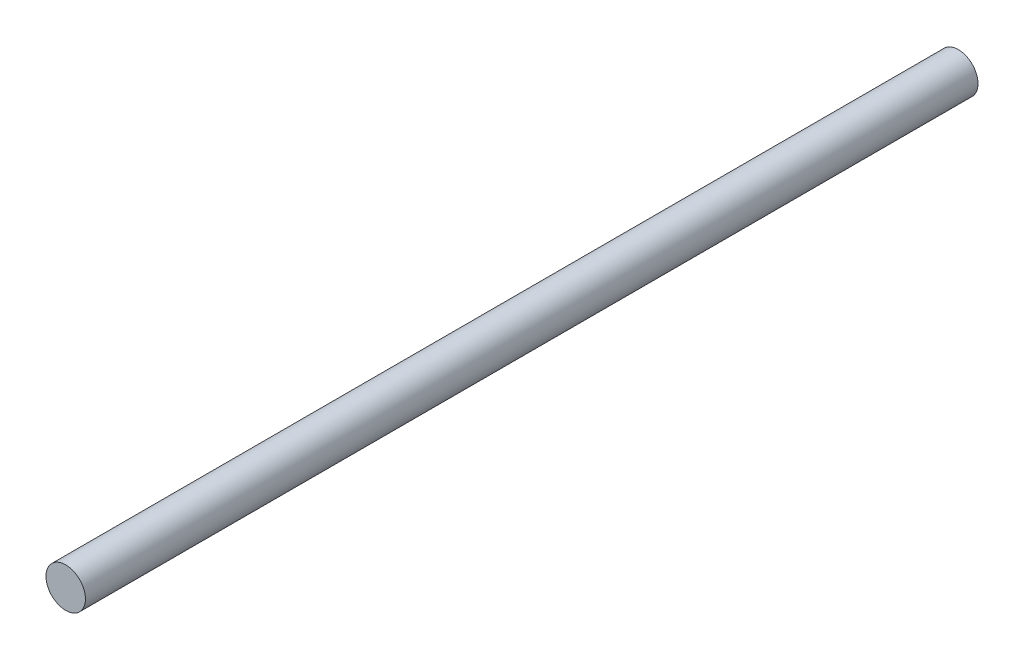
ISO-10303-21;
HEADER;
FILE_DESCRIPTION(('STEP AP214'),'2;1');
FILE_NAME('part.step','',(''),(''),'','','');
FILE_SCHEMA(('AUTOMOTIVE_DESIGN { 1 0 10303 214 1 1 1 1 }'));
ENDSEC;
DATA;
#1=APPLICATION_CONTEXT('core data for automotive mechanical design processes');
#2=APPLICATION_PROTOCOL_DEFINITION('international standard','automotive_design',2000,#1);
#3=PRODUCT_CONTEXT('',#1,'mechanical');
#4=PRODUCT('Part','Part','',(#3));
#5=PRODUCT_RELATED_PRODUCT_CATEGORY('part','',(#4));
#6=PRODUCT_DEFINITION_FORMATION('','',#4);
#7=PRODUCT_DEFINITION_CONTEXT('part definition',#1,'design');
#8=PRODUCT_DEFINITION('design','',#6,#7);
#9=PRODUCT_DEFINITION_SHAPE('','',#8);
#10=(LENGTH_UNIT() NAMED_UNIT(*) SI_UNIT(.MILLI.,.METRE.));
#11=(NAMED_UNIT(*) PLANE_ANGLE_UNIT() SI_UNIT($,.RADIAN.));
#12=(NAMED_UNIT(*) SI_UNIT($,.STERADIAN.) SOLID_ANGLE_UNIT());
#13=UNCERTAINTY_MEASURE_WITH_UNIT(LENGTH_MEASURE(1.E-05),#10,'distance_accuracy_value','');
#14=(GEOMETRIC_REPRESENTATION_CONTEXT(3) GLOBAL_UNCERTAINTY_ASSIGNED_CONTEXT((#13)) GLOBAL_UNIT_ASSIGNED_CONTEXT((#10,
#11,#12)) REPRESENTATION_CONTEXT('',''));
#15=CARTESIAN_POINT('',(0.,0.,0.));
#16=DIRECTION('',(0.,0.,1.));
#17=DIRECTION('',(1.,0.,0.));
#18=AXIS2_PLACEMENT_3D('',#15,#16,#17);
#19=CARTESIAN_POINT('',(0.,0.,113.));
#20=DIRECTION('',(0.,0.,-1.));
#21=DIRECTION('',(-1.,0.,0.));
#22=AXIS2_PLACEMENT_3D('',#19,#20,#21);
#23=CYLINDRICAL_SURFACE('',#22,2.5);
#24=CARTESIAN_POINT('',(0.,0.,113.));
#25=DIRECTION('',(0.,0.,1.));
#26=DIRECTION('',(1.,0.,0.));
#27=AXIS2_PLACEMENT_3D('',#24,#25,#26);
#28=CIRCLE('',#27,2.5);
#29=CARTESIAN_POINT('',(2.5,0.,113.));
#30=VERTEX_POINT('',#29);
#31=EDGE_CURVE('E10',#30,#30,#28,.T.);
#32=ORIENTED_EDGE('',*,*,#31,.F.);
#33=EDGE_LOOP('',(#32));
#34=FACE_BOUND('',#33,.T.);
#35=CARTESIAN_POINT('',(0.,0.,0.));
#36=DIRECTION('',(0.,0.,1.));
#37=DIRECTION('',(1.,0.,0.));
#38=AXIS2_PLACEMENT_3D('',#35,#36,#37);
#39=CIRCLE('',#38,2.5);
#40=CARTESIAN_POINT('',(2.5,0.,0.));
#41=VERTEX_POINT('',#40);
#42=EDGE_CURVE('E33',#41,#41,#39,.T.);
#43=ORIENTED_EDGE('',*,*,#42,.T.);
#44=EDGE_LOOP('',(#43));
#45=FACE_BOUND('',#44,.T.);
#46=ADVANCED_FACE('F30',(#34,#45),#23,.T.);
#47=CARTESIAN_POINT('',(0.,0.,113.));
#48=DIRECTION('',(0.,0.,1.));
#49=DIRECTION('',(1.,0.,0.));
#50=AXIS2_PLACEMENT_3D('',#47,#48,#49);
#51=PLANE('',#50);
#52=ORIENTED_EDGE('',*,*,#31,.T.);
#53=EDGE_LOOP('',(#52));
#54=FACE_BOUND('',#53,.T.);
#55=ADVANCED_FACE('F45',(#54),#51,.T.);
#56=CARTESIAN_POINT('',(0.,0.,0.));
#57=DIRECTION('',(0.,0.,1.));
#58=DIRECTION('',(1.,0.,0.));
#59=AXIS2_PLACEMENT_3D('',#56,#57,#58);
#60=PLANE('',#59);
#61=ORIENTED_EDGE('',*,*,#42,.F.);
#62=EDGE_LOOP('',(#61));
#63=FACE_BOUND('',#62,.T.);
#64=ADVANCED_FACE('F43',(#63),#60,.F.);
#65=CLOSED_SHELL('',(#46,#55,#64));
#66=MANIFOLD_SOLID_BREP('B2',#65);
#67=ADVANCED_BREP_SHAPE_REPRESENTATION('',(#18,#66),#14);
#68=SHAPE_DEFINITION_REPRESENTATION(#9,#67);
ENDSEC;
END-ISO-10303-21;
